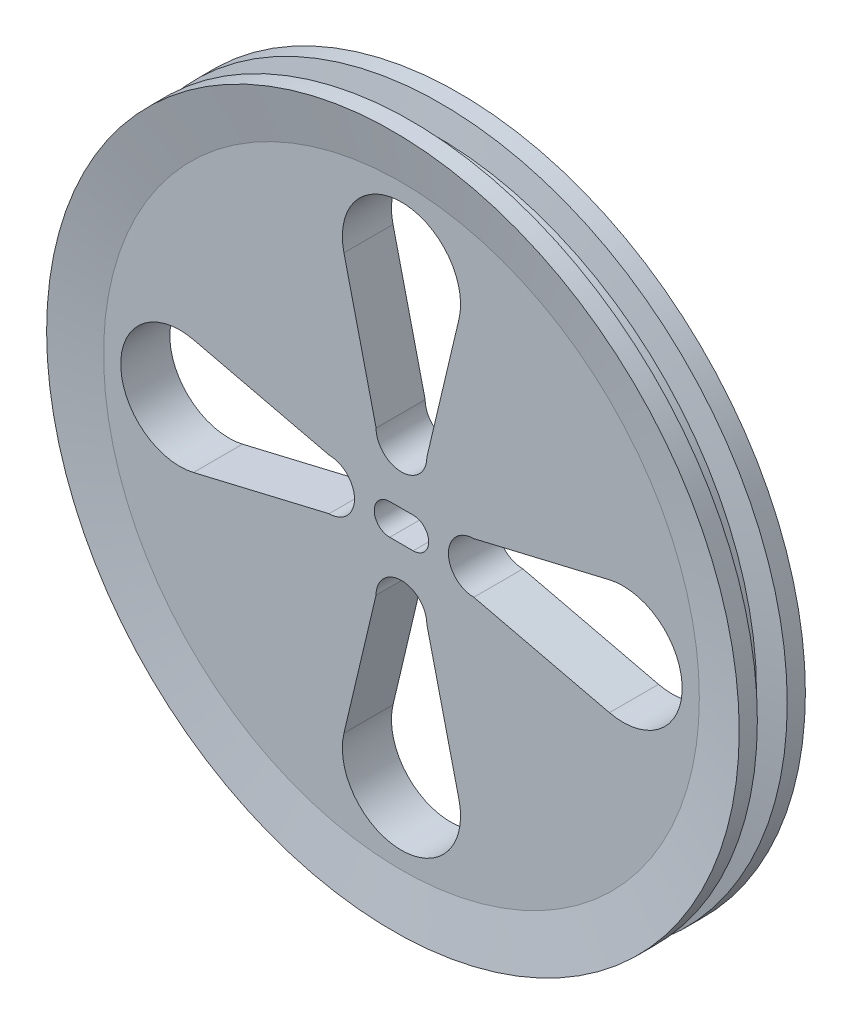
ISO-10303-21;
HEADER;
FILE_DESCRIPTION(('STEP AP214'),'2;1');
FILE_NAME('part.step','',(''),(''),'','','');
FILE_SCHEMA(('AUTOMOTIVE_DESIGN { 1 0 10303 214 1 1 1 1 }'));
ENDSEC;
DATA;
#1=APPLICATION_CONTEXT('core data for automotive mechanical design processes');
#2=APPLICATION_PROTOCOL_DEFINITION('international standard','automotive_design',2000,#1);
#3=PRODUCT_CONTEXT('',#1,'mechanical');
#4=PRODUCT('Part','Part','',(#3));
#5=PRODUCT_RELATED_PRODUCT_CATEGORY('part','',(#4));
#6=PRODUCT_DEFINITION_FORMATION('','',#4);
#7=PRODUCT_DEFINITION_CONTEXT('part definition',#1,'design');
#8=PRODUCT_DEFINITION('design','',#6,#7);
#9=PRODUCT_DEFINITION_SHAPE('','',#8);
#10=(LENGTH_UNIT() NAMED_UNIT(*) SI_UNIT(.MILLI.,.METRE.));
#11=(NAMED_UNIT(*) PLANE_ANGLE_UNIT() SI_UNIT($,.RADIAN.));
#12=(NAMED_UNIT(*) SI_UNIT($,.STERADIAN.) SOLID_ANGLE_UNIT());
#13=UNCERTAINTY_MEASURE_WITH_UNIT(LENGTH_MEASURE(1.E-05),#10,'distance_accuracy_value','');
#14=(GEOMETRIC_REPRESENTATION_CONTEXT(3) GLOBAL_UNCERTAINTY_ASSIGNED_CONTEXT((#13)) GLOBAL_UNIT_ASSIGNED_CONTEXT((#10,
#11,#12)) REPRESENTATION_CONTEXT('',''));
#15=CARTESIAN_POINT('',(0.,0.,0.));
#16=DIRECTION('',(0.,0.,1.));
#17=DIRECTION('',(1.,0.,0.));
#18=AXIS2_PLACEMENT_3D('',#15,#16,#17);
#19=CARTESIAN_POINT('',(0.,35.4494776712683,2.921));
#20=DIRECTION('',(0.,0.,-1.));
#21=DIRECTION('',(-1.,0.,0.));
#22=AXIS2_PLACEMENT_3D('',#19,#20,#21);
#23=PLANE('',#22);
#24=CARTESIAN_POINT('',(8.60978505689319,0.,2.921));
#25=DIRECTION('',(0.,0.,1.));
#26=DIRECTION('',(0.,-1.,0.));
#27=AXIS2_PLACEMENT_3D('',#24,#25,#26);
#28=CIRCLE('',#27,3.02064099367331);
#29=CARTESIAN_POINT('',(8.60978505689323,-3.02064099367321,2.921));
#30=VERTEX_POINT('',#29);
#31=CARTESIAN_POINT('',(8.60978505689316,3.0206409936734,2.921));
#32=VERTEX_POINT('',#31);
#33=EDGE_CURVE('E68',#30,#32,#28,.F.);
#34=ORIENTED_EDGE('',*,*,#33,.T.);
#35=DIRECTION('',(0.973065429152086,0.2305291100687,0.));
#36=VECTOR('',#35,1.);
#37=CARTESIAN_POINT('',(-0.22003432714684,0.928766856860391,2.921));
#38=LINE('',#37,#36);
#39=CARTESIAN_POINT('',(24.7491405171766,6.8442186687981,2.921));
#40=VERTEX_POINT('',#39);
#41=EDGE_CURVE('E206',#32,#40,#38,.T.);
#42=ORIENTED_EDGE('',*,*,#41,.T.);
#43=CARTESIAN_POINT('',(26.3706056227743,2.76217432277724E-13,2.921));
#44=DIRECTION('',(0.,0.,1.));
#45=DIRECTION('',(0.,-1.,0.));
#46=AXIS2_PLACEMENT_3D('',#43,#44,#45);
#47=CIRCLE('',#46,7.03366748396536);
#48=CARTESIAN_POINT('',(24.7491405171767,-6.84421866879759,2.921));
#49=VERTEX_POINT('',#48);
#50=EDGE_CURVE('E188',#40,#49,#47,.F.);
#51=ORIENTED_EDGE('',*,*,#50,.T.);
#52=DIRECTION('',(0.973065429152091,-0.23052911006868,0.));
#53=VECTOR('',#52,1.);
#54=CARTESIAN_POINT('',(-0.22003432714682,-0.928766856860396,2.921));
#55=LINE('',#54,#53);
#56=EDGE_CURVE('E199',#30,#49,#55,.T.);
#57=ORIENTED_EDGE('',*,*,#56,.F.);
#58=EDGE_LOOP('',(#34,#42,#51,#57));
#59=FACE_BOUND('',#58,.T.);
#60=CARTESIAN_POINT('',(1.397,0.,2.921));
#61=DIRECTION('',(0.,0.,-1.));
#62=DIRECTION('',(-1.,0.,0.));
#63=AXIS2_PLACEMENT_3D('',#60,#61,#62);
#64=CIRCLE('',#63,1.8415);
#65=CARTESIAN_POINT('',(1.397,1.8415,2.921));
#66=VERTEX_POINT('',#65);
#67=CARTESIAN_POINT('',(1.397,-1.8415,2.921));
#68=VERTEX_POINT('',#67);
#69=EDGE_CURVE('E266',#66,#68,#64,.T.);
#70=ORIENTED_EDGE('',*,*,#69,.T.);
#71=DIRECTION('',(-1.,0.,0.));
#72=VECTOR('',#71,1.);
#73=CARTESIAN_POINT('',(1.397,-1.8415,2.921));
#74=LINE('',#73,#72);
#75=CARTESIAN_POINT('',(-1.397,-1.8415,2.921));
#76=VERTEX_POINT('',#75);
#77=EDGE_CURVE('E279',#68,#76,#74,.T.);
#78=ORIENTED_EDGE('',*,*,#77,.T.);
#79=CARTESIAN_POINT('',(-1.397,0.,2.921));
#80=DIRECTION('',(0.,0.,-1.));
#81=DIRECTION('',(-1.,0.,0.));
#82=AXIS2_PLACEMENT_3D('',#79,#80,#81);
#83=CIRCLE('',#82,1.8415);
#84=CARTESIAN_POINT('',(-1.397,1.8415,2.921));
#85=VERTEX_POINT('',#84);
#86=EDGE_CURVE('E283',#76,#85,#83,.T.);
#87=ORIENTED_EDGE('',*,*,#86,.T.);
#88=DIRECTION('',(1.,0.,0.));
#89=VECTOR('',#88,1.);
#90=CARTESIAN_POINT('',(1.397,1.8415,2.921));
#91=LINE('',#90,#89);
#92=EDGE_CURVE('E287',#85,#66,#91,.T.);
#93=ORIENTED_EDGE('',*,*,#92,.T.);
#94=EDGE_LOOP('',(#70,#78,#87,#93));
#95=FACE_BOUND('',#94,.T.);
#96=CARTESIAN_POINT('',(0.,0.,2.921));
#97=DIRECTION('',(0.,0.,1.));
#98=DIRECTION('',(1.,0.,0.));
#99=AXIS2_PLACEMENT_3D('',#96,#97,#98);
#100=CIRCLE('',#99,35.4494776712683);
#101=CARTESIAN_POINT('',(35.4494776712683,0.,2.921));
#102=VERTEX_POINT('',#101);
#103=EDGE_CURVE('E324',#102,#102,#100,.T.);
#104=ORIENTED_EDGE('',*,*,#103,.T.);
#105=EDGE_LOOP('',(#104));
#106=FACE_BOUND('',#105,.T.);
#107=CARTESIAN_POINT('',(0.,8.60978505689319,2.921));
#108=DIRECTION('',(0.,0.,1.));
#109=DIRECTION('',(1.,0.,0.));
#110=AXIS2_PLACEMENT_3D('',#107,#108,#109);
#111=CIRCLE('',#110,3.02064099367331);
#112=CARTESIAN_POINT('',(3.02064099367331,8.60978505689319,2.921));
#113=VERTEX_POINT('',#112);
#114=CARTESIAN_POINT('',(-3.02064099367331,8.60978505689319,2.921));
#115=VERTEX_POINT('',#114);
#116=EDGE_CURVE('E304',#113,#115,#111,.F.);
#117=ORIENTED_EDGE('',*,*,#116,.T.);
#118=DIRECTION('',(-0.23052911006869,0.973065429152088,0.));
#119=VECTOR('',#118,1.);
#120=CARTESIAN_POINT('',(-0.928766856860394,-0.22003432714683,2.921));
#121=LINE('',#120,#119);
#122=CARTESIAN_POINT('',(-6.84421866879784,24.7491405171766,2.921));
#123=VERTEX_POINT('',#122);
#124=EDGE_CURVE('E316',#115,#123,#121,.T.);
#125=ORIENTED_EDGE('',*,*,#124,.T.);
#126=CARTESIAN_POINT('',(0.,26.3706056227743,2.921));
#127=DIRECTION('',(0.,0.,1.));
#128=DIRECTION('',(1.,0.,0.));
#129=AXIS2_PLACEMENT_3D('',#126,#127,#128);
#130=CIRCLE('',#129,7.03366748396536);
#131=CARTESIAN_POINT('',(6.84421866879784,24.7491405171766,2.921));
#132=VERTEX_POINT('',#131);
#133=EDGE_CURVE('E312',#123,#132,#130,.F.);
#134=ORIENTED_EDGE('',*,*,#133,.T.);
#135=DIRECTION('',(0.23052911006869,0.973065429152088,0.));
#136=VECTOR('',#135,1.);
#137=CARTESIAN_POINT('',(0.928766856860394,-0.22003432714683,2.921));
#138=LINE('',#137,#136);
#139=EDGE_CURVE('E308',#113,#132,#138,.T.);
#140=ORIENTED_EDGE('',*,*,#139,.F.);
#141=EDGE_LOOP('',(#117,#125,#134,#140));
#142=FACE_BOUND('',#141,.T.);
#143=CARTESIAN_POINT('',(-8.60978505689319,0.,2.921));
#144=DIRECTION('',(0.,0.,1.));
#145=DIRECTION('',(0.,1.,0.));
#146=AXIS2_PLACEMENT_3D('',#143,#144,#145);
#147=CIRCLE('',#146,3.02064099367331);
#148=CARTESIAN_POINT('',(-8.6097850568932,3.02064099367328,2.921));
#149=VERTEX_POINT('',#148);
#150=CARTESIAN_POINT('',(-8.60978505689318,-3.02064099367334,2.921));
#151=VERTEX_POINT('',#150);
#152=EDGE_CURVE('E238',#149,#151,#147,.F.);
#153=ORIENTED_EDGE('',*,*,#152,.T.);
#154=DIRECTION('',(-0.973065429152088,-0.230529110068693,0.));
#155=VECTOR('',#154,1.);
#156=CARTESIAN_POINT('',(0.220034327146833,-0.928766856860393,2.921));
#157=LINE('',#156,#155);
#158=CARTESIAN_POINT('',(-24.7491405171766,-6.84421866879793,2.921));
#159=VERTEX_POINT('',#158);
#160=EDGE_CURVE('E258',#151,#159,#157,.T.);
#161=ORIENTED_EDGE('',*,*,#160,.T.);
#162=CARTESIAN_POINT('',(-26.3706056227743,0.,2.921));
#163=DIRECTION('',(0.,0.,1.));
#164=DIRECTION('',(0.,1.,0.));
#165=AXIS2_PLACEMENT_3D('',#162,#163,#164);
#166=CIRCLE('',#165,7.03366748396536);
#167=CARTESIAN_POINT('',(-24.7491405171767,6.84421866879776,2.921));
#168=VERTEX_POINT('',#167);
#169=EDGE_CURVE('E254',#159,#168,#166,.F.);
#170=ORIENTED_EDGE('',*,*,#169,.T.);
#171=DIRECTION('',(-0.973065429152089,0.230529110068687,0.));
#172=VECTOR('',#171,1.);
#173=CARTESIAN_POINT('',(0.220034327146827,0.928766856860394,2.921));
#174=LINE('',#173,#172);
#175=EDGE_CURVE('E250',#149,#168,#174,.T.);
#176=ORIENTED_EDGE('',*,*,#175,.F.);
#177=EDGE_LOOP('',(#153,#161,#170,#176));
#178=FACE_BOUND('',#177,.T.);
#179=CARTESIAN_POINT('',(0.,-8.60978505689319,2.921));
#180=DIRECTION('',(0.,0.,1.));
#181=DIRECTION('',(-1.,0.,0.));
#182=AXIS2_PLACEMENT_3D('',#179,#180,#181);
#183=CIRCLE('',#182,3.02064099367331);
#184=CARTESIAN_POINT('',(-3.02064099367331,-8.60978505689319,2.921));
#185=VERTEX_POINT('',#184);
#186=CARTESIAN_POINT('',(3.02064099367331,-8.60978505689319,2.921));
#187=VERTEX_POINT('',#186);
#188=EDGE_CURVE('E60',#185,#187,#183,.F.);
#189=ORIENTED_EDGE('',*,*,#188,.T.);
#190=DIRECTION('',(0.23052911006869,-0.973065429152088,0.));
#191=VECTOR('',#190,1.);
#192=CARTESIAN_POINT('',(0.928766856860394,0.22003432714683,2.921));
#193=LINE('',#192,#191);
#194=CARTESIAN_POINT('',(6.84421866879784,-24.7491405171766,2.921));
#195=VERTEX_POINT('',#194);
#196=EDGE_CURVE('E230',#187,#195,#193,.T.);
#197=ORIENTED_EDGE('',*,*,#196,.T.);
#198=CARTESIAN_POINT('',(0.,-26.3706056227743,2.921));
#199=DIRECTION('',(0.,0.,1.));
#200=DIRECTION('',(-1.,0.,0.));
#201=AXIS2_PLACEMENT_3D('',#198,#199,#200);
#202=CIRCLE('',#201,7.03366748396536);
#203=CARTESIAN_POINT('',(-6.84421866879784,-24.7491405171766,2.921));
#204=VERTEX_POINT('',#203);
#205=EDGE_CURVE('E226',#195,#204,#202,.F.);
#206=ORIENTED_EDGE('',*,*,#205,.T.);
#207=DIRECTION('',(-0.23052911006869,-0.973065429152088,0.));
#208=VECTOR('',#207,1.);
#209=CARTESIAN_POINT('',(-0.928766856860394,0.22003432714683,2.921));
#210=LINE('',#209,#208);
#211=EDGE_CURVE('E222',#185,#204,#210,.T.);
#212=ORIENTED_EDGE('',*,*,#211,.F.);
#213=EDGE_LOOP('',(#189,#197,#206,#212));
#214=FACE_BOUND('',#213,.T.);
#215=ADVANCED_FACE('F45',(#59,#95,#106,#142,#178,#214),#23,.F.);
#216=CARTESIAN_POINT('',(0.,35.4494776712683,-2.921));
#217=DIRECTION('',(0.,0.,1.));
#218=DIRECTION('',(1.,0.,0.));
#219=AXIS2_PLACEMENT_3D('',#216,#217,#218);
#220=PLANE('',#219);
#221=CARTESIAN_POINT('',(8.60978505689319,0.,-2.921));
#222=DIRECTION('',(0.,0.,1.));
#223=DIRECTION('',(1.,0.,0.));
#224=AXIS2_PLACEMENT_3D('',#221,#222,#223);
#225=CIRCLE('',#224,3.02064099367331);
#226=CARTESIAN_POINT('',(8.60978505689322,-3.02064099367322,-2.921));
#227=VERTEX_POINT('',#226);
#228=CARTESIAN_POINT('',(8.60978505689316,3.0206409936734,-2.921));
#229=VERTEX_POINT('',#228);
#230=EDGE_CURVE('E414',#227,#229,#225,.F.);
#231=ORIENTED_EDGE('',*,*,#230,.F.);
#232=DIRECTION('',(0.973065429152091,-0.23052911006868,0.));
#233=VECTOR('',#232,1.);
#234=CARTESIAN_POINT('',(-8.17205787648958,0.955148507055643,-2.921));
#235=LINE('',#234,#233);
#236=CARTESIAN_POINT('',(24.7491405171767,-6.84421866879758,-2.921));
#237=VERTEX_POINT('',#236);
#238=EDGE_CURVE('E406',#227,#237,#235,.T.);
#239=ORIENTED_EDGE('',*,*,#238,.T.);
#240=CARTESIAN_POINT('',(26.3706056227743,2.76217432277724E-13,-2.921));
#241=DIRECTION('',(0.,0.,1.));
#242=DIRECTION('',(1.,0.,0.));
#243=AXIS2_PLACEMENT_3D('',#240,#241,#242);
#244=CIRCLE('',#243,7.03366748396536);
#245=CARTESIAN_POINT('',(24.7491405171766,6.8442186687981,-2.921));
#246=VERTEX_POINT('',#245);
#247=EDGE_CURVE('E191',#246,#237,#244,.F.);
#248=ORIENTED_EDGE('',*,*,#247,.F.);
#249=DIRECTION('',(0.973065429152086,0.2305291100687,0.));
#250=VECTOR('',#249,1.);
#251=CARTESIAN_POINT('',(7.73198922219658,2.81268222077677,-2.921));
#252=LINE('',#251,#250);
#253=EDGE_CURVE('E411',#229,#246,#252,.T.);
#254=ORIENTED_EDGE('',*,*,#253,.F.);
#255=EDGE_LOOP('',(#231,#239,#248,#254));
#256=FACE_BOUND('',#255,.T.);
#257=CARTESIAN_POINT('',(1.397,0.,-2.921));
#258=DIRECTION('',(0.,0.,1.));
#259=DIRECTION('',(1.,0.,0.));
#260=AXIS2_PLACEMENT_3D('',#257,#258,#259);
#261=CIRCLE('',#260,1.8415);
#262=CARTESIAN_POINT('',(1.397,1.8415,-2.921));
#263=VERTEX_POINT('',#262);
#264=CARTESIAN_POINT('',(1.397,-1.8415,-2.921));
#265=VERTEX_POINT('',#264);
#266=EDGE_CURVE('E389',#263,#265,#261,.F.);
#267=ORIENTED_EDGE('',*,*,#266,.F.);
#268=DIRECTION('',(1.,0.,0.));
#269=VECTOR('',#268,1.);
#270=CARTESIAN_POINT('',(0.,1.8415,-2.921));
#271=LINE('',#270,#269);
#272=CARTESIAN_POINT('',(-1.397,1.8415,-2.921));
#273=VERTEX_POINT('',#272);
#274=EDGE_CURVE('E379',#273,#263,#271,.T.);
#275=ORIENTED_EDGE('',*,*,#274,.F.);
#276=CARTESIAN_POINT('',(-1.397,0.,-2.921));
#277=DIRECTION('',(0.,0.,1.));
#278=DIRECTION('',(1.,0.,0.));
#279=AXIS2_PLACEMENT_3D('',#276,#277,#278);
#280=CIRCLE('',#279,1.8415);
#281=CARTESIAN_POINT('',(-1.397,-1.8415,-2.921));
#282=VERTEX_POINT('',#281);
#283=EDGE_CURVE('E382',#282,#273,#280,.F.);
#284=ORIENTED_EDGE('',*,*,#283,.F.);
#285=DIRECTION('',(-1.,0.,0.));
#286=VECTOR('',#285,1.);
#287=CARTESIAN_POINT('',(0.,-1.8415,-2.921));
#288=LINE('',#287,#286);
#289=EDGE_CURVE('E386',#265,#282,#288,.T.);
#290=ORIENTED_EDGE('',*,*,#289,.F.);
#291=EDGE_LOOP('',(#267,#275,#284,#290));
#292=FACE_BOUND('',#291,.T.);
#293=CARTESIAN_POINT('',(0.,0.,-2.921));
#294=DIRECTION('',(0.,0.,1.));
#295=DIRECTION('',(1.,0.,0.));
#296=AXIS2_PLACEMENT_3D('',#293,#294,#295);
#297=CIRCLE('',#296,35.4494776712683);
#298=CARTESIAN_POINT('',(35.4494776712683,0.,-2.921));
#299=VERTEX_POINT('',#298);
#300=EDGE_CURVE('E361',#299,#299,#297,.T.);
#301=ORIENTED_EDGE('',*,*,#300,.F.);
#302=EDGE_LOOP('',(#301));
#303=FACE_BOUND('',#302,.T.);
#304=CARTESIAN_POINT('',(0.,8.60978505689319,-2.921));
#305=DIRECTION('',(0.,0.,1.));
#306=DIRECTION('',(1.,0.,0.));
#307=AXIS2_PLACEMENT_3D('',#304,#305,#306);
#308=CIRCLE('',#307,3.02064099367331);
#309=CARTESIAN_POINT('',(3.02064099367331,8.60978505689319,-2.921));
#310=VERTEX_POINT('',#309);
#311=CARTESIAN_POINT('',(-3.02064099367331,8.60978505689319,-2.921));
#312=VERTEX_POINT('',#311);
#313=EDGE_CURVE('E376',#310,#312,#308,.F.);
#314=ORIENTED_EDGE('',*,*,#313,.F.);
#315=DIRECTION('',(0.23052911006869,0.973065429152088,0.));
#316=VECTOR('',#315,1.);
#317=CARTESIAN_POINT('',(8.88079040620349,33.3455279802053,-2.921));
#318=LINE('',#317,#316);
#319=CARTESIAN_POINT('',(6.84421866879784,24.7491405171767,-2.921));
#320=VERTEX_POINT('',#319);
#321=EDGE_CURVE('E365',#310,#320,#318,.T.);
#322=ORIENTED_EDGE('',*,*,#321,.T.);
#323=CARTESIAN_POINT('',(0.,26.3706056227743,-2.921));
#324=DIRECTION('',(0.,0.,1.));
#325=DIRECTION('',(1.,0.,0.));
#326=AXIS2_PLACEMENT_3D('',#323,#324,#325);
#327=CIRCLE('',#326,7.03366748396536);
#328=CARTESIAN_POINT('',(-6.84421866879784,24.7491405171766,-2.921));
#329=VERTEX_POINT('',#328);
#330=EDGE_CURVE('E369',#329,#320,#327,.F.);
#331=ORIENTED_EDGE('',*,*,#330,.F.);
#332=DIRECTION('',(-0.23052911006869,0.973065429152088,0.));
#333=VECTOR('',#332,1.);
#334=CARTESIAN_POINT('',(-8.88079040620349,33.3455279802053,-2.921));
#335=LINE('',#334,#333);
#336=EDGE_CURVE('E373',#312,#329,#335,.T.);
#337=ORIENTED_EDGE('',*,*,#336,.F.);
#338=EDGE_LOOP('',(#314,#322,#331,#337));
#339=FACE_BOUND('',#338,.T.);
#340=CARTESIAN_POINT('',(-8.60978505689319,0.,-2.921));
#341=DIRECTION('',(0.,0.,1.));
#342=DIRECTION('',(1.,0.,0.));
#343=AXIS2_PLACEMENT_3D('',#340,#341,#342);
#344=CIRCLE('',#343,3.02064099367331);
#345=CARTESIAN_POINT('',(-8.6097850568932,3.02064099367328,-2.921));
#346=VERTEX_POINT('',#345);
#347=CARTESIAN_POINT('',(-8.60978505689318,-3.02064099367334,-2.921));
#348=VERTEX_POINT('',#347);
#349=EDGE_CURVE('E403',#346,#348,#344,.F.);
#350=ORIENTED_EDGE('',*,*,#349,.F.);
#351=DIRECTION('',(-0.973065429152089,0.230529110068687,0.));
#352=VECTOR('',#351,1.);
#353=CARTESIAN_POINT('',(-7.73198922219616,2.81268222077653,-2.921));
#354=LINE('',#353,#352);
#355=CARTESIAN_POINT('',(-24.7491405171767,6.84421866879775,-2.921));
#356=VERTEX_POINT('',#355);
#357=EDGE_CURVE('E392',#346,#356,#354,.T.);
#358=ORIENTED_EDGE('',*,*,#357,.T.);
#359=CARTESIAN_POINT('',(-26.3706056227743,0.,-2.921));
#360=DIRECTION('',(0.,0.,1.));
#361=DIRECTION('',(1.,0.,0.));
#362=AXIS2_PLACEMENT_3D('',#359,#360,#361);
#363=CIRCLE('',#362,7.03366748396536);
#364=CARTESIAN_POINT('',(-24.7491405171766,-6.84421866879793,-2.921));
#365=VERTEX_POINT('',#364);
#366=EDGE_CURVE('E396',#365,#356,#363,.F.);
#367=ORIENTED_EDGE('',*,*,#366,.F.);
#368=DIRECTION('',(-0.973065429152087,-0.230529110068693,0.));
#369=VECTOR('',#368,1.);
#370=CARTESIAN_POINT('',(8.17205787649003,0.955148507055865,-2.921));
#371=LINE('',#370,#369);
#372=EDGE_CURVE('E400',#348,#365,#371,.T.);
#373=ORIENTED_EDGE('',*,*,#372,.F.);
#374=EDGE_LOOP('',(#350,#358,#367,#373));
#375=FACE_BOUND('',#374,.T.);
#376=CARTESIAN_POINT('',(0.,-8.60978505689319,-2.921));
#377=DIRECTION('',(0.,0.,1.));
#378=DIRECTION('',(1.,0.,0.));
#379=AXIS2_PLACEMENT_3D('',#376,#377,#378);
#380=CIRCLE('',#379,3.02064099367331);
#381=CARTESIAN_POINT('',(-3.02064099367331,-8.60978505689319,-2.921));
#382=VERTEX_POINT('',#381);
#383=CARTESIAN_POINT('',(3.02064099367331,-8.60978505689319,-2.921));
#384=VERTEX_POINT('',#383);
#385=EDGE_CURVE('E11',#382,#384,#380,.F.);
#386=ORIENTED_EDGE('',*,*,#385,.F.);
#387=DIRECTION('',(-0.23052911006869,-0.973065429152088,0.));
#388=VECTOR('',#387,1.);
#389=CARTESIAN_POINT('',(7.0232566924827,33.7855966344989,-2.921));
#390=LINE('',#389,#388);
#391=CARTESIAN_POINT('',(-6.84421866879784,-24.7491405171766,-2.921));
#392=VERTEX_POINT('',#391);
#393=EDGE_CURVE('E417',#382,#392,#390,.T.);
#394=ORIENTED_EDGE('',*,*,#393,.T.);
#395=CARTESIAN_POINT('',(0.,-26.3706056227743,-2.921));
#396=DIRECTION('',(0.,0.,1.));
#397=DIRECTION('',(1.,0.,0.));
#398=AXIS2_PLACEMENT_3D('',#395,#396,#397);
#399=CIRCLE('',#398,7.03366748396536);
#400=CARTESIAN_POINT('',(6.84421866879784,-24.7491405171766,-2.921));
#401=VERTEX_POINT('',#400);
#402=EDGE_CURVE('E421',#401,#392,#399,.F.);
#403=ORIENTED_EDGE('',*,*,#402,.F.);
#404=DIRECTION('',(0.23052911006869,-0.973065429152088,0.));
#405=VECTOR('',#404,1.);
#406=CARTESIAN_POINT('',(-7.0232566924827,33.7855966344989,-2.921));
#407=LINE('',#406,#405);
#408=EDGE_CURVE('E53',#384,#401,#407,.T.);
#409=ORIENTED_EDGE('',*,*,#408,.F.);
#410=EDGE_LOOP('',(#386,#394,#403,#409));
#411=FACE_BOUND('',#410,.T.);
#412=ADVANCED_FACE('F437',(#256,#292,#303,#339,#375,#411),#220,.F.);
#413=CARTESIAN_POINT('',(0.,0.,-2.921));
#414=DIRECTION('',(0.,0.,-1.));
#415=DIRECTION('',(-1.,0.,0.));
#416=AXIS2_PLACEMENT_3D('',#413,#414,#415);
#417=CONICAL_SURFACE('',#416,35.4494776712683,1.39626340159547);
#418=CARTESIAN_POINT('',(0.,0.,-3.937));
#419=DIRECTION('',(0.,0.,1.));
#420=DIRECTION('',(1.,0.,0.));
#421=AXIS2_PLACEMENT_3D('',#418,#419,#420);
#422=CIRCLE('',#421,41.2115);
#423=CARTESIAN_POINT('',(41.2115,0.,-3.937));
#424=VERTEX_POINT('',#423);
#425=EDGE_CURVE('E357',#424,#424,#422,.T.);
#426=ORIENTED_EDGE('',*,*,#425,.F.);
#427=EDGE_LOOP('',(#426));
#428=FACE_BOUND('',#427,.T.);
#429=ORIENTED_EDGE('',*,*,#300,.T.);
#430=EDGE_LOOP('',(#429));
#431=FACE_BOUND('',#430,.T.);
#432=ADVANCED_FACE('F447',(#428,#431),#417,.F.);
#433=CARTESIAN_POINT('',(0.,0.,2.921));
#434=DIRECTION('',(0.,0.,1.));
#435=DIRECTION('',(1.,0.,0.));
#436=AXIS2_PLACEMENT_3D('',#433,#434,#435);
#437=CYLINDRICAL_SURFACE('',#436,41.2115);
#438=CARTESIAN_POINT('',(0.,0.,-1.778));
#439=DIRECTION('',(0.,0.,1.));
#440=DIRECTION('',(1.,0.,0.));
#441=AXIS2_PLACEMENT_3D('',#438,#439,#440);
#442=CIRCLE('',#441,41.2115);
#443=CARTESIAN_POINT('',(41.2115,0.,-1.778));
#444=VERTEX_POINT('',#443);
#445=EDGE_CURVE('E353',#444,#444,#442,.T.);
#446=ORIENTED_EDGE('',*,*,#445,.F.);
#447=EDGE_LOOP('',(#446));
#448=FACE_BOUND('',#447,.T.);
#449=ORIENTED_EDGE('',*,*,#425,.T.);
#450=EDGE_LOOP('',(#449));
#451=FACE_BOUND('',#450,.T.);
#452=ADVANCED_FACE('F452',(#448,#451),#437,.T.);
#453=CARTESIAN_POINT('',(0.,0.,-1.778));
#454=DIRECTION('',(0.,0.,-1.));
#455=DIRECTION('',(-1.,0.,0.));
#456=AXIS2_PLACEMENT_3D('',#453,#454,#455);
#457=CONICAL_SURFACE('',#456,41.2115,1.39626340159547);
#458=CARTESIAN_POINT('',(0.,0.,-1.22935859952562));
#459=DIRECTION('',(0.,0.,1.));
#460=DIRECTION('',(1.,0.,0.));
#461=AXIS2_PLACEMENT_3D('',#458,#459,#460);
#462=CIRCLE('',#461,38.1);
#463=CARTESIAN_POINT('',(38.1,0.,-1.22935859952562));
#464=VERTEX_POINT('',#463);
#465=EDGE_CURVE('E349',#464,#464,#462,.T.);
#466=ORIENTED_EDGE('',*,*,#465,.F.);
#467=EDGE_LOOP('',(#466));
#468=FACE_BOUND('',#467,.T.);
#469=ORIENTED_EDGE('',*,*,#445,.T.);
#470=EDGE_LOOP('',(#469));
#471=FACE_BOUND('',#470,.T.);
#472=ADVANCED_FACE('F460',(#468,#471),#457,.T.);
#473=CARTESIAN_POINT('',(0.,0.,2.921));
#474=DIRECTION('',(0.,0.,1.));
#475=DIRECTION('',(1.,0.,0.));
#476=AXIS2_PLACEMENT_3D('',#473,#474,#475);
#477=CYLINDRICAL_SURFACE('',#476,38.1);
#478=CARTESIAN_POINT('',(0.,0.,1.22935859952562));
#479=DIRECTION('',(0.,0.,1.));
#480=DIRECTION('',(1.,0.,0.));
#481=AXIS2_PLACEMENT_3D('',#478,#479,#480);
#482=CIRCLE('',#481,38.1);
#483=CARTESIAN_POINT('',(38.1,0.,1.22935859952562));
#484=VERTEX_POINT('',#483);
#485=EDGE_CURVE('E345',#484,#484,#482,.T.);
#486=ORIENTED_EDGE('',*,*,#485,.F.);
#487=EDGE_LOOP('',(#486));
#488=FACE_BOUND('',#487,.T.);
#489=ORIENTED_EDGE('',*,*,#465,.T.);
#490=EDGE_LOOP('',(#489));
#491=FACE_BOUND('',#490,.T.);
#492=ADVANCED_FACE('F464',(#488,#491),#477,.T.);
#493=CARTESIAN_POINT('',(0.,0.,1.22935859952562));
#494=DIRECTION('',(0.,0.,1.));
#495=DIRECTION('',(1.,0.,0.));
#496=AXIS2_PLACEMENT_3D('',#493,#494,#495);
#497=CONICAL_SURFACE('',#496,38.1,1.39626340159547);
#498=CARTESIAN_POINT('',(0.,0.,1.778));
#499=DIRECTION('',(0.,0.,1.));
#500=DIRECTION('',(1.,0.,0.));
#501=AXIS2_PLACEMENT_3D('',#498,#499,#500);
#502=CIRCLE('',#501,41.2115);
#503=CARTESIAN_POINT('',(41.2115,0.,1.778));
#504=VERTEX_POINT('',#503);
#505=EDGE_CURVE('E341',#504,#504,#502,.T.);
#506=ORIENTED_EDGE('',*,*,#505,.F.);
#507=EDGE_LOOP('',(#506));
#508=FACE_BOUND('',#507,.T.);
#509=ORIENTED_EDGE('',*,*,#485,.T.);
#510=EDGE_LOOP('',(#509));
#511=FACE_BOUND('',#510,.T.);
#512=ADVANCED_FACE('F468',(#508,#511),#497,.T.);
#513=CARTESIAN_POINT('',(0.,0.,2.921));
#514=DIRECTION('',(0.,0.,1.));
#515=DIRECTION('',(1.,0.,0.));
#516=AXIS2_PLACEMENT_3D('',#513,#514,#515);
#517=CYLINDRICAL_SURFACE('',#516,41.2115);
#518=CARTESIAN_POINT('',(0.,0.,3.937));
#519=DIRECTION('',(0.,0.,1.));
#520=DIRECTION('',(1.,0.,0.));
#521=AXIS2_PLACEMENT_3D('',#518,#519,#520);
#522=CIRCLE('',#521,41.2115);
#523=CARTESIAN_POINT('',(41.2115,0.,3.937));
#524=VERTEX_POINT('',#523);
#525=EDGE_CURVE('E337',#524,#524,#522,.T.);
#526=ORIENTED_EDGE('',*,*,#525,.F.);
#527=EDGE_LOOP('',(#526));
#528=FACE_BOUND('',#527,.T.);
#529=ORIENTED_EDGE('',*,*,#505,.T.);
#530=EDGE_LOOP('',(#529));
#531=FACE_BOUND('',#530,.T.);
#532=ADVANCED_FACE('F472',(#528,#531),#517,.T.);
#533=CARTESIAN_POINT('',(0.,0.,3.937));
#534=DIRECTION('',(0.,0.,1.));
#535=DIRECTION('',(1.,0.,0.));
#536=AXIS2_PLACEMENT_3D('',#533,#534,#535);
#537=CONICAL_SURFACE('',#536,41.2115,1.39626340159547);
#538=ORIENTED_EDGE('',*,*,#103,.F.);
#539=EDGE_LOOP('',(#538));
#540=FACE_BOUND('',#539,.T.);
#541=ORIENTED_EDGE('',*,*,#525,.T.);
#542=EDGE_LOOP('',(#541));
#543=FACE_BOUND('',#542,.T.);
#544=ADVANCED_FACE('F476',(#540,#543),#537,.F.);
#545=CARTESIAN_POINT('',(0.,8.60978505689319,-3.937));
#546=DIRECTION('',(0.,0.,1.));
#547=DIRECTION('',(1.,0.,0.));
#548=AXIS2_PLACEMENT_3D('',#545,#546,#547);
#549=CYLINDRICAL_SURFACE('',#548,3.02064099367331);
#550=ORIENTED_EDGE('',*,*,#313,.T.);
#551=DIRECTION('',(0.,0.,1.));
#552=VECTOR('',#551,1.);
#553=CARTESIAN_POINT('',(-3.02064099367331,8.60978505689319,-3.937));
#554=LINE('',#553,#552);
#555=EDGE_CURVE('E321',#312,#115,#554,.T.);
#556=ORIENTED_EDGE('',*,*,#555,.T.);
#557=ORIENTED_EDGE('',*,*,#116,.F.);
#558=DIRECTION('',(0.,0.,1.));
#559=VECTOR('',#558,1.);
#560=CARTESIAN_POINT('',(3.02064099367331,8.60978505689319,-3.937));
#561=LINE('',#560,#559);
#562=EDGE_CURVE('E320',#310,#113,#561,.T.);
#563=ORIENTED_EDGE('',*,*,#562,.F.);
#564=EDGE_LOOP('',(#550,#556,#557,#563));
#565=FACE_BOUND('',#564,.T.);
#566=ADVANCED_FACE('F480',(#565),#549,.F.);
#567=CARTESIAN_POINT('',(-0.928766856860394,-0.22003432714683,-3.937));
#568=DIRECTION('',(0.973065429152088,0.23052911006869,0.));
#569=DIRECTION('',(-0.23052911006869,0.973065429152088,0.));
#570=AXIS2_PLACEMENT_3D('',#567,#568,#569);
#571=PLANE('',#570);
#572=ORIENTED_EDGE('',*,*,#336,.T.);
#573=DIRECTION('',(0.,0.,1.));
#574=VECTOR('',#573,1.);
#575=CARTESIAN_POINT('',(-6.84421866879784,24.7491405171766,-3.937));
#576=LINE('',#575,#574);
#577=EDGE_CURVE('E325',#329,#123,#576,.T.);
#578=ORIENTED_EDGE('',*,*,#577,.T.);
#579=ORIENTED_EDGE('',*,*,#124,.F.);
#580=ORIENTED_EDGE('',*,*,#555,.F.);
#581=EDGE_LOOP('',(#572,#578,#579,#580));
#582=FACE_BOUND('',#581,.T.);
#583=ADVANCED_FACE('F484',(#582),#571,.T.);
#584=CARTESIAN_POINT('',(0.,26.3706056227743,-3.937));
#585=DIRECTION('',(0.,0.,1.));
#586=DIRECTION('',(1.,0.,0.));
#587=AXIS2_PLACEMENT_3D('',#584,#585,#586);
#588=CYLINDRICAL_SURFACE('',#587,7.03366748396536);
#589=ORIENTED_EDGE('',*,*,#330,.T.);
#590=DIRECTION('',(0.,0.,1.));
#591=VECTOR('',#590,1.);
#592=CARTESIAN_POINT('',(6.84421866879784,24.7491405171766,-3.937));
#593=LINE('',#592,#591);
#594=EDGE_CURVE('E328',#320,#132,#593,.T.);
#595=ORIENTED_EDGE('',*,*,#594,.T.);
#596=ORIENTED_EDGE('',*,*,#133,.F.);
#597=ORIENTED_EDGE('',*,*,#577,.F.);
#598=EDGE_LOOP('',(#589,#595,#596,#597));
#599=FACE_BOUND('',#598,.T.);
#600=ADVANCED_FACE('F490',(#599),#588,.F.);
#601=CARTESIAN_POINT('',(0.928766856860394,-0.22003432714683,-3.937));
#602=DIRECTION('',(0.973065429152088,-0.23052911006869,0.));
#603=DIRECTION('',(0.23052911006869,0.973065429152088,0.));
#604=AXIS2_PLACEMENT_3D('',#601,#602,#603);
#605=PLANE('',#604);
#606=ORIENTED_EDGE('',*,*,#562,.T.);
#607=ORIENTED_EDGE('',*,*,#139,.T.);
#608=ORIENTED_EDGE('',*,*,#594,.F.);
#609=ORIENTED_EDGE('',*,*,#321,.F.);
#610=EDGE_LOOP('',(#606,#607,#608,#609));
#611=FACE_BOUND('',#610,.T.);
#612=ADVANCED_FACE('F486',(#611),#605,.F.);
#613=CARTESIAN_POINT('',(1.397,0.,-3.937));
#614=DIRECTION('',(0.,0.,1.));
#615=DIRECTION('',(1.,0.,0.));
#616=AXIS2_PLACEMENT_3D('',#613,#614,#615);
#617=CYLINDRICAL_SURFACE('',#616,1.8415);
#618=ORIENTED_EDGE('',*,*,#266,.T.);
#619=DIRECTION('',(0.,0.,1.));
#620=VECTOR('',#619,1.);
#621=CARTESIAN_POINT('',(1.397,-1.8415,-3.937));
#622=LINE('',#621,#620);
#623=EDGE_CURVE('E301',#265,#68,#622,.T.);
#624=ORIENTED_EDGE('',*,*,#623,.T.);
#625=ORIENTED_EDGE('',*,*,#69,.F.);
#626=DIRECTION('',(0.,0.,1.));
#627=VECTOR('',#626,1.);
#628=CARTESIAN_POINT('',(1.397,1.8415,-3.937));
#629=LINE('',#628,#627);
#630=EDGE_CURVE('E291',#263,#66,#629,.T.);
#631=ORIENTED_EDGE('',*,*,#630,.F.);
#632=EDGE_LOOP('',(#618,#624,#625,#631));
#633=FACE_BOUND('',#632,.T.);
#634=ADVANCED_FACE('F489',(#633),#617,.F.);
#635=CARTESIAN_POINT('',(1.397,-1.8415,-3.937));
#636=DIRECTION('',(0.,1.,0.));
#637=DIRECTION('',(0.,0.,1.));
#638=AXIS2_PLACEMENT_3D('',#635,#636,#637);
#639=PLANE('',#638);
#640=ORIENTED_EDGE('',*,*,#289,.T.);
#641=DIRECTION('',(0.,0.,1.));
#642=VECTOR('',#641,1.);
#643=CARTESIAN_POINT('',(-1.397,-1.8415,-3.937));
#644=LINE('',#643,#642);
#645=EDGE_CURVE('E298',#282,#76,#644,.T.);
#646=ORIENTED_EDGE('',*,*,#645,.T.);
#647=ORIENTED_EDGE('',*,*,#77,.F.);
#648=ORIENTED_EDGE('',*,*,#623,.F.);
#649=EDGE_LOOP('',(#640,#646,#647,#648));
#650=FACE_BOUND('',#649,.T.);
#651=ADVANCED_FACE('F500',(#650),#639,.T.);
#652=CARTESIAN_POINT('',(-1.397,0.,-3.937));
#653=DIRECTION('',(0.,0.,1.));
#654=DIRECTION('',(1.,0.,0.));
#655=AXIS2_PLACEMENT_3D('',#652,#653,#654);
#656=CYLINDRICAL_SURFACE('',#655,1.8415);
#657=ORIENTED_EDGE('',*,*,#283,.T.);
#658=DIRECTION('',(0.,0.,1.));
#659=VECTOR('',#658,1.);
#660=CARTESIAN_POINT('',(-1.397,1.8415,-3.937));
#661=LINE('',#660,#659);
#662=EDGE_CURVE('E295',#273,#85,#661,.T.);
#663=ORIENTED_EDGE('',*,*,#662,.T.);
#664=ORIENTED_EDGE('',*,*,#86,.F.);
#665=ORIENTED_EDGE('',*,*,#645,.F.);
#666=EDGE_LOOP('',(#657,#663,#664,#665));
#667=FACE_BOUND('',#666,.T.);
#668=ADVANCED_FACE('F504',(#667),#656,.F.);
#669=CARTESIAN_POINT('',(1.397,1.8415,-3.937));
#670=DIRECTION('',(0.,-1.,0.));
#671=DIRECTION('',(0.,0.,-1.));
#672=AXIS2_PLACEMENT_3D('',#669,#670,#671);
#673=PLANE('',#672);
#674=ORIENTED_EDGE('',*,*,#274,.T.);
#675=ORIENTED_EDGE('',*,*,#630,.T.);
#676=ORIENTED_EDGE('',*,*,#92,.F.);
#677=ORIENTED_EDGE('',*,*,#662,.F.);
#678=EDGE_LOOP('',(#674,#675,#676,#677));
#679=FACE_BOUND('',#678,.T.);
#680=ADVANCED_FACE('F508',(#679),#673,.T.);
#681=CARTESIAN_POINT('',(-8.60978505689319,0.,-3.937));
#682=DIRECTION('',(0.,0.,1.));
#683=DIRECTION('',(1.,0.,0.));
#684=AXIS2_PLACEMENT_3D('',#681,#682,#683);
#685=CYLINDRICAL_SURFACE('',#684,3.02064099367331);
#686=ORIENTED_EDGE('',*,*,#349,.T.);
#687=DIRECTION('',(0.,0.,1.));
#688=VECTOR('',#687,1.);
#689=CARTESIAN_POINT('',(-8.60978505689318,-3.02064099367334,-3.937));
#690=LINE('',#689,#688);
#691=EDGE_CURVE('E263',#348,#151,#690,.T.);
#692=ORIENTED_EDGE('',*,*,#691,.T.);
#693=ORIENTED_EDGE('',*,*,#152,.F.);
#694=DIRECTION('',(0.,0.,1.));
#695=VECTOR('',#694,1.);
#696=CARTESIAN_POINT('',(-8.6097850568932,3.02064099367328,-3.937));
#697=LINE('',#696,#695);
#698=EDGE_CURVE('E262',#346,#149,#697,.T.);
#699=ORIENTED_EDGE('',*,*,#698,.F.);
#700=EDGE_LOOP('',(#686,#692,#693,#699));
#701=FACE_BOUND('',#700,.T.);
#702=ADVANCED_FACE('F512',(#701),#685,.F.);
#703=CARTESIAN_POINT('',(0.220034327146833,-0.928766856860393,-3.937));
#704=DIRECTION('',(-0.230529110068693,0.973065429152087,0.));
#705=DIRECTION('',(-0.973065429152087,-0.230529110068693,0.));
#706=AXIS2_PLACEMENT_3D('',#703,#704,#705);
#707=PLANE('',#706);
#708=ORIENTED_EDGE('',*,*,#372,.T.);
#709=DIRECTION('',(0.,0.,1.));
#710=VECTOR('',#709,1.);
#711=CARTESIAN_POINT('',(-24.7491405171766,-6.84421866879793,-3.937));
#712=LINE('',#711,#710);
#713=EDGE_CURVE('E267',#365,#159,#712,.T.);
#714=ORIENTED_EDGE('',*,*,#713,.T.);
#715=ORIENTED_EDGE('',*,*,#160,.F.);
#716=ORIENTED_EDGE('',*,*,#691,.F.);
#717=EDGE_LOOP('',(#708,#714,#715,#716));
#718=FACE_BOUND('',#717,.T.);
#719=ADVANCED_FACE('F516',(#718),#707,.T.);
#720=CARTESIAN_POINT('',(-26.3706056227743,0.,-3.937));
#721=DIRECTION('',(0.,0.,1.));
#722=DIRECTION('',(1.,0.,0.));
#723=AXIS2_PLACEMENT_3D('',#720,#721,#722);
#724=CYLINDRICAL_SURFACE('',#723,7.03366748396536);
#725=ORIENTED_EDGE('',*,*,#366,.T.);
#726=DIRECTION('',(0.,0.,1.));
#727=VECTOR('',#726,1.);
#728=CARTESIAN_POINT('',(-24.7491405171767,6.84421866879776,-3.937));
#729=LINE('',#728,#727);
#730=EDGE_CURVE('E270',#356,#168,#729,.T.);
#731=ORIENTED_EDGE('',*,*,#730,.T.);
#732=ORIENTED_EDGE('',*,*,#169,.F.);
#733=ORIENTED_EDGE('',*,*,#713,.F.);
#734=EDGE_LOOP('',(#725,#731,#732,#733));
#735=FACE_BOUND('',#734,.T.);
#736=ADVANCED_FACE('F522',(#735),#724,.F.);
#737=CARTESIAN_POINT('',(0.220034327146827,0.928766856860394,-3.937));
#738=DIRECTION('',(0.230529110068687,0.973065429152089,0.));
#739=DIRECTION('',(-0.973065429152089,0.230529110068687,0.));
#740=AXIS2_PLACEMENT_3D('',#737,#738,#739);
#741=PLANE('',#740);
#742=ORIENTED_EDGE('',*,*,#698,.T.);
#743=ORIENTED_EDGE('',*,*,#175,.T.);
#744=ORIENTED_EDGE('',*,*,#730,.F.);
#745=ORIENTED_EDGE('',*,*,#357,.F.);
#746=EDGE_LOOP('',(#742,#743,#744,#745));
#747=FACE_BOUND('',#746,.T.);
#748=ADVANCED_FACE('F518',(#747),#741,.F.);
#749=CARTESIAN_POINT('',(8.60978505689319,0.,-3.937));
#750=DIRECTION('',(0.,0.,1.));
#751=DIRECTION('',(1.,0.,0.));
#752=AXIS2_PLACEMENT_3D('',#749,#750,#751);
#753=CYLINDRICAL_SURFACE('',#752,3.02064099367331);
#754=ORIENTED_EDGE('',*,*,#230,.T.);
#755=DIRECTION('',(0.,0.,1.));
#756=VECTOR('',#755,1.);
#757=CARTESIAN_POINT('',(8.60978505689316,3.0206409936734,-3.937));
#758=LINE('',#757,#756);
#759=EDGE_CURVE('E213',#229,#32,#758,.T.);
#760=ORIENTED_EDGE('',*,*,#759,.T.);
#761=ORIENTED_EDGE('',*,*,#33,.F.);
#762=DIRECTION('',(0.,0.,1.));
#763=VECTOR('',#762,1.);
#764=CARTESIAN_POINT('',(8.60978505689322,-3.02064099367322,-3.937));
#765=LINE('',#764,#763);
#766=EDGE_CURVE('E196',#227,#30,#765,.T.);
#767=ORIENTED_EDGE('',*,*,#766,.F.);
#768=EDGE_LOOP('',(#754,#760,#761,#767));
#769=FACE_BOUND('',#768,.T.);
#770=ADVANCED_FACE('F521',(#769),#753,.F.);
#771=CARTESIAN_POINT('',(-0.22003432714684,0.928766856860391,-3.937));
#772=DIRECTION('',(0.2305291100687,-0.973065429152086,0.));
#773=DIRECTION('',(0.973065429152086,0.2305291100687,0.));
#774=AXIS2_PLACEMENT_3D('',#771,#772,#773);
#775=PLANE('',#774);
#776=ORIENTED_EDGE('',*,*,#253,.T.);
#777=DIRECTION('',(0.,0.,1.));
#778=VECTOR('',#777,1.);
#779=CARTESIAN_POINT('',(24.7491405171766,6.8442186687981,-3.937));
#780=LINE('',#779,#778);
#781=EDGE_CURVE('E195',#246,#40,#780,.T.);
#782=ORIENTED_EDGE('',*,*,#781,.T.);
#783=ORIENTED_EDGE('',*,*,#41,.F.);
#784=ORIENTED_EDGE('',*,*,#759,.F.);
#785=EDGE_LOOP('',(#776,#782,#783,#784));
#786=FACE_BOUND('',#785,.T.);
#787=ADVANCED_FACE('F540',(#786),#775,.T.);
#788=CARTESIAN_POINT('',(26.3706056227743,2.76217432277724E-13,-3.937));
#789=DIRECTION('',(0.,0.,1.));
#790=DIRECTION('',(1.,0.,0.));
#791=AXIS2_PLACEMENT_3D('',#788,#789,#790);
#792=CYLINDRICAL_SURFACE('',#791,7.03366748396536);
#793=ORIENTED_EDGE('',*,*,#247,.T.);
#794=DIRECTION('',(0.,0.,1.));
#795=VECTOR('',#794,1.);
#796=CARTESIAN_POINT('',(24.7491405171767,-6.84421866879759,-3.937));
#797=LINE('',#796,#795);
#798=EDGE_CURVE('E183',#237,#49,#797,.T.);
#799=ORIENTED_EDGE('',*,*,#798,.T.);
#800=ORIENTED_EDGE('',*,*,#50,.F.);
#801=ORIENTED_EDGE('',*,*,#781,.F.);
#802=EDGE_LOOP('',(#793,#799,#800,#801));
#803=FACE_BOUND('',#802,.T.);
#804=ADVANCED_FACE('F185',(#803),#792,.F.);
#805=CARTESIAN_POINT('',(-0.22003432714682,-0.928766856860396,-3.937));
#806=DIRECTION('',(-0.23052911006868,-0.973065429152091,0.));
#807=DIRECTION('',(0.973065429152091,-0.23052911006868,0.));
#808=AXIS2_PLACEMENT_3D('',#805,#806,#807);
#809=PLANE('',#808);
#810=ORIENTED_EDGE('',*,*,#766,.T.);
#811=ORIENTED_EDGE('',*,*,#56,.T.);
#812=ORIENTED_EDGE('',*,*,#798,.F.);
#813=ORIENTED_EDGE('',*,*,#238,.F.);
#814=EDGE_LOOP('',(#810,#811,#812,#813));
#815=FACE_BOUND('',#814,.T.);
#816=ADVANCED_FACE('F200',(#815),#809,.F.);
#817=CARTESIAN_POINT('',(0.,-8.60978505689319,-3.937));
#818=DIRECTION('',(0.,0.,1.));
#819=DIRECTION('',(1.,0.,0.));
#820=AXIS2_PLACEMENT_3D('',#817,#818,#819);
#821=CYLINDRICAL_SURFACE('',#820,3.02064099367331);
#822=ORIENTED_EDGE('',*,*,#385,.T.);
#823=DIRECTION('',(0.,0.,1.));
#824=VECTOR('',#823,1.);
#825=CARTESIAN_POINT('',(3.02064099367331,-8.60978505689319,-3.937));
#826=LINE('',#825,#824);
#827=EDGE_CURVE('E235',#384,#187,#826,.T.);
#828=ORIENTED_EDGE('',*,*,#827,.T.);
#829=ORIENTED_EDGE('',*,*,#188,.F.);
#830=DIRECTION('',(0.,0.,1.));
#831=VECTOR('',#830,1.);
#832=CARTESIAN_POINT('',(-3.02064099367331,-8.60978505689319,-3.937));
#833=LINE('',#832,#831);
#834=EDGE_CURVE('E234',#382,#185,#833,.T.);
#835=ORIENTED_EDGE('',*,*,#834,.F.);
#836=EDGE_LOOP('',(#822,#828,#829,#835));
#837=FACE_BOUND('',#836,.T.);
#838=ADVANCED_FACE('F441',(#837),#821,.F.);
#839=CARTESIAN_POINT('',(0.928766856860394,0.22003432714683,-3.937));
#840=DIRECTION('',(-0.973065429152088,-0.23052911006869,0.));
#841=DIRECTION('',(0.23052911006869,-0.973065429152088,0.));
#842=AXIS2_PLACEMENT_3D('',#839,#840,#841);
#843=PLANE('',#842);
#844=ORIENTED_EDGE('',*,*,#408,.T.);
#845=DIRECTION('',(0.,0.,1.));
#846=VECTOR('',#845,1.);
#847=CARTESIAN_POINT('',(6.84421866879784,-24.7491405171766,-3.937));
#848=LINE('',#847,#846);
#849=EDGE_CURVE('E239',#401,#195,#848,.T.);
#850=ORIENTED_EDGE('',*,*,#849,.T.);
#851=ORIENTED_EDGE('',*,*,#196,.F.);
#852=ORIENTED_EDGE('',*,*,#827,.F.);
#853=EDGE_LOOP('',(#844,#850,#851,#852));
#854=FACE_BOUND('',#853,.T.);
#855=ADVANCED_FACE('F429',(#854),#843,.T.);
#856=CARTESIAN_POINT('',(0.,-26.3706056227743,-3.937));
#857=DIRECTION('',(0.,0.,1.));
#858=DIRECTION('',(1.,0.,0.));
#859=AXIS2_PLACEMENT_3D('',#856,#857,#858);
#860=CYLINDRICAL_SURFACE('',#859,7.03366748396536);
#861=ORIENTED_EDGE('',*,*,#402,.T.);
#862=DIRECTION('',(0.,0.,1.));
#863=VECTOR('',#862,1.);
#864=CARTESIAN_POINT('',(-6.84421866879784,-24.7491405171766,-3.937));
#865=LINE('',#864,#863);
#866=EDGE_CURVE('E242',#392,#204,#865,.T.);
#867=ORIENTED_EDGE('',*,*,#866,.T.);
#868=ORIENTED_EDGE('',*,*,#205,.F.);
#869=ORIENTED_EDGE('',*,*,#849,.F.);
#870=EDGE_LOOP('',(#861,#867,#868,#869));
#871=FACE_BOUND('',#870,.T.);
#872=ADVANCED_FACE('F436',(#871),#860,.F.);
#873=CARTESIAN_POINT('',(-0.928766856860394,0.22003432714683,-3.937));
#874=DIRECTION('',(-0.973065429152088,0.23052911006869,0.));
#875=DIRECTION('',(-0.23052911006869,-0.973065429152088,0.));
#876=AXIS2_PLACEMENT_3D('',#873,#874,#875);
#877=PLANE('',#876);
#878=ORIENTED_EDGE('',*,*,#834,.T.);
#879=ORIENTED_EDGE('',*,*,#211,.T.);
#880=ORIENTED_EDGE('',*,*,#866,.F.);
#881=ORIENTED_EDGE('',*,*,#393,.F.);
#882=EDGE_LOOP('',(#878,#879,#880,#881));
#883=FACE_BOUND('',#882,.T.);
#884=ADVANCED_FACE('F439',(#883),#877,.F.);
#885=CLOSED_SHELL('',(#215,#412,#432,#452,#472,#492,#512,#532,#544,#566,#583,#600,#612,#634,
#651,#668,#680,#702,#719,#736,#748,#770,#787,#804,#816,#838,#855,#872,#884));
#886=MANIFOLD_SOLID_BREP('B2',#885);
#887=ADVANCED_BREP_SHAPE_REPRESENTATION('',(#18,#886),#14);
#888=SHAPE_DEFINITION_REPRESENTATION(#9,#887);
ENDSEC;
END-ISO-10303-21;
